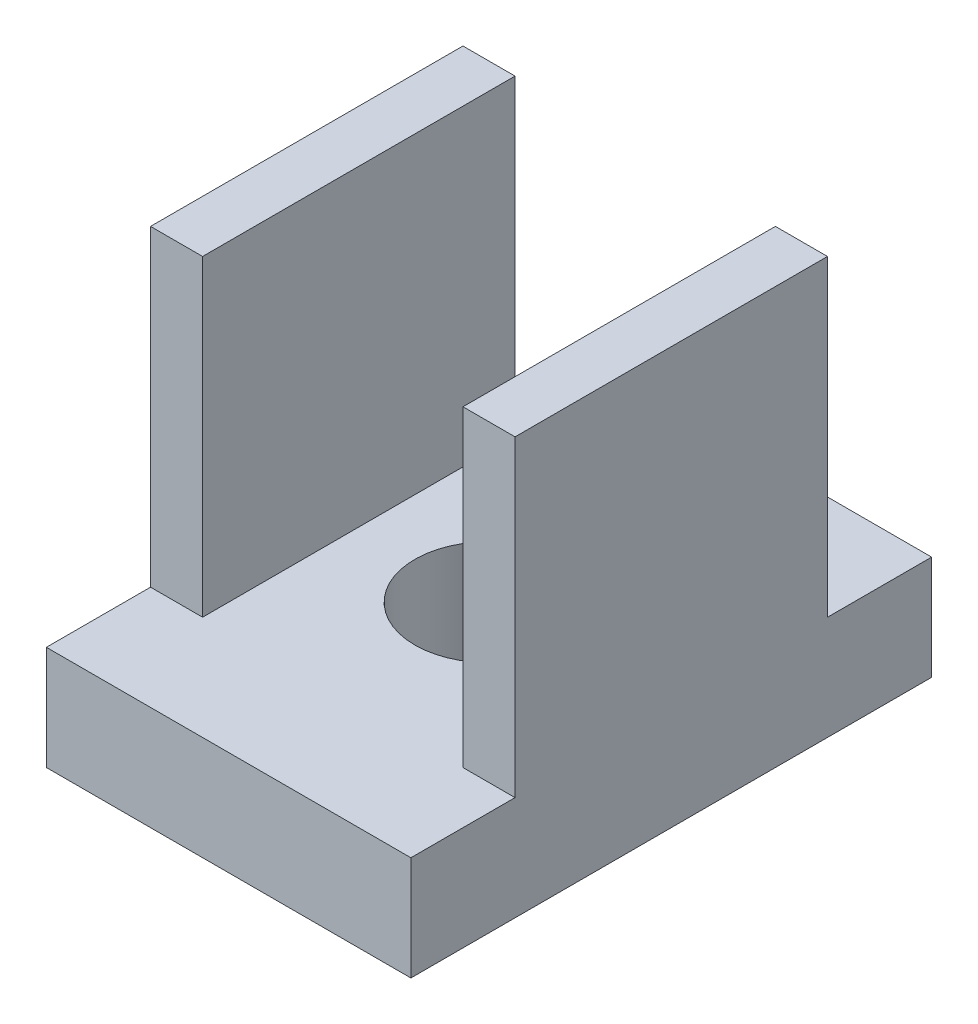
ISO-10303-21;
HEADER;
FILE_DESCRIPTION(('STEP AP214'),'2;1');
FILE_NAME('part.step','',(''),(''),'','','');
FILE_SCHEMA(('AUTOMOTIVE_DESIGN { 1 0 10303 214 1 1 1 1 }'));
ENDSEC;
DATA;
#1=APPLICATION_CONTEXT('core data for automotive mechanical design processes');
#2=APPLICATION_PROTOCOL_DEFINITION('international standard','automotive_design',2000,#1);
#3=PRODUCT_CONTEXT('',#1,'mechanical');
#4=PRODUCT('Part','Part','',(#3));
#5=PRODUCT_RELATED_PRODUCT_CATEGORY('part','',(#4));
#6=PRODUCT_DEFINITION_FORMATION('','',#4);
#7=PRODUCT_DEFINITION_CONTEXT('part definition',#1,'design');
#8=PRODUCT_DEFINITION('design','',#6,#7);
#9=PRODUCT_DEFINITION_SHAPE('','',#8);
#10=(LENGTH_UNIT() NAMED_UNIT(*) SI_UNIT(.MILLI.,.METRE.));
#11=(NAMED_UNIT(*) PLANE_ANGLE_UNIT() SI_UNIT($,.RADIAN.));
#12=(NAMED_UNIT(*) SI_UNIT($,.STERADIAN.) SOLID_ANGLE_UNIT());
#13=UNCERTAINTY_MEASURE_WITH_UNIT(LENGTH_MEASURE(1.E-05),#10,'distance_accuracy_value','');
#14=(GEOMETRIC_REPRESENTATION_CONTEXT(3) GLOBAL_UNCERTAINTY_ASSIGNED_CONTEXT((#13)) GLOBAL_UNIT_ASSIGNED_CONTEXT((#10,
#11,#12)) REPRESENTATION_CONTEXT('',''));
#15=CARTESIAN_POINT('',(0.,0.,0.));
#16=DIRECTION('',(0.,0.,1.));
#17=DIRECTION('',(1.,0.,0.));
#18=AXIS2_PLACEMENT_3D('',#15,#16,#17);
#19=CARTESIAN_POINT('',(0.,2.,0.));
#20=DIRECTION('',(0.,1.,0.));
#21=DIRECTION('',(0.,0.,1.));
#22=AXIS2_PLACEMENT_3D('',#19,#20,#21);
#23=PLANE('',#22);
#24=CARTESIAN_POINT('',(0.,2.,0.));
#25=DIRECTION('',(0.,1.,0.));
#26=DIRECTION('',(0.,0.,1.));
#27=AXIS2_PLACEMENT_3D('',#24,#25,#26);
#28=CIRCLE('',#27,1.425);
#29=CARTESIAN_POINT('',(0.,2.,1.425));
#30=VERTEX_POINT('',#29);
#31=EDGE_CURVE('E182',#30,#30,#28,.T.);
#32=ORIENTED_EDGE('',*,*,#31,.F.);
#33=EDGE_LOOP('',(#32));
#34=FACE_BOUND('',#33,.T.);
#35=DIRECTION('',(0.,0.,-1.));
#36=VECTOR('',#35,1.);
#37=CARTESIAN_POINT('',(-2.5,2.,3.));
#38=LINE('',#37,#36);
#39=CARTESIAN_POINT('',(-2.5,2.,3.));
#40=VERTEX_POINT('',#39);
#41=CARTESIAN_POINT('',(-2.5,2.,-3.));
#42=VERTEX_POINT('',#41);
#43=EDGE_CURVE('E52',#40,#42,#38,.T.);
#44=ORIENTED_EDGE('',*,*,#43,.F.);
#45=DIRECTION('',(1.,0.,0.));
#46=VECTOR('',#45,1.);
#47=CARTESIAN_POINT('',(-2.5,2.,3.));
#48=LINE('',#47,#46);
#49=CARTESIAN_POINT('',(-3.5,2.,3.));
#50=VERTEX_POINT('',#49);
#51=EDGE_CURVE('E146',#50,#40,#48,.T.);
#52=ORIENTED_EDGE('',*,*,#51,.F.);
#53=DIRECTION('',(0.,0.,1.));
#54=VECTOR('',#53,1.);
#55=CARTESIAN_POINT('',(-3.5,2.,-5.));
#56=LINE('',#55,#54);
#57=CARTESIAN_POINT('',(-3.5,2.,5.));
#58=VERTEX_POINT('',#57);
#59=EDGE_CURVE('E194',#50,#58,#56,.T.);
#60=ORIENTED_EDGE('',*,*,#59,.T.);
#61=DIRECTION('',(1.,0.,0.));
#62=VECTOR('',#61,1.);
#63=CARTESIAN_POINT('',(-3.5,2.,5.));
#64=LINE('',#63,#62);
#65=CARTESIAN_POINT('',(3.5,2.,5.));
#66=VERTEX_POINT('',#65);
#67=EDGE_CURVE('E197',#58,#66,#64,.T.);
#68=ORIENTED_EDGE('',*,*,#67,.T.);
#69=DIRECTION('',(0.,0.,-1.));
#70=VECTOR('',#69,1.);
#71=CARTESIAN_POINT('',(3.5,2.,-5.));
#72=LINE('',#71,#70);
#73=CARTESIAN_POINT('',(3.5,2.,3.));
#74=VERTEX_POINT('',#73);
#75=EDGE_CURVE('E189',#66,#74,#72,.T.);
#76=ORIENTED_EDGE('',*,*,#75,.T.);
#77=DIRECTION('',(1.,0.,0.));
#78=VECTOR('',#77,1.);
#79=CARTESIAN_POINT('',(2.5,2.,3.));
#80=LINE('',#79,#78);
#81=CARTESIAN_POINT('',(2.5,2.,3.));
#82=VERTEX_POINT('',#81);
#83=EDGE_CURVE('E150',#82,#74,#80,.T.);
#84=ORIENTED_EDGE('',*,*,#83,.F.);
#85=DIRECTION('',(0.,0.,1.));
#86=VECTOR('',#85,1.);
#87=CARTESIAN_POINT('',(2.5,2.,3.));
#88=LINE('',#87,#86);
#89=CARTESIAN_POINT('',(2.5,2.,-3.));
#90=VERTEX_POINT('',#89);
#91=EDGE_CURVE('E147',#90,#82,#88,.T.);
#92=ORIENTED_EDGE('',*,*,#91,.F.);
#93=DIRECTION('',(-1.,0.,0.));
#94=VECTOR('',#93,1.);
#95=CARTESIAN_POINT('',(2.5,2.,-3.));
#96=LINE('',#95,#94);
#97=CARTESIAN_POINT('',(3.5,2.,-3.));
#98=VERTEX_POINT('',#97);
#99=EDGE_CURVE('E160',#98,#90,#96,.T.);
#100=ORIENTED_EDGE('',*,*,#99,.F.);
#101=CARTESIAN_POINT('',(3.5,2.,-5.));
#102=VERTEX_POINT('',#101);
#103=EDGE_CURVE('E192',#98,#102,#72,.T.);
#104=ORIENTED_EDGE('',*,*,#103,.T.);
#105=DIRECTION('',(-1.,0.,0.));
#106=VECTOR('',#105,1.);
#107=CARTESIAN_POINT('',(-3.5,2.,-5.));
#108=LINE('',#107,#106);
#109=CARTESIAN_POINT('',(-3.5,2.,-5.));
#110=VERTEX_POINT('',#109);
#111=EDGE_CURVE('E191',#102,#110,#108,.T.);
#112=ORIENTED_EDGE('',*,*,#111,.T.);
#113=CARTESIAN_POINT('',(-3.5,2.,-3.));
#114=VERTEX_POINT('',#113);
#115=EDGE_CURVE('E195',#110,#114,#56,.T.);
#116=ORIENTED_EDGE('',*,*,#115,.T.);
#117=DIRECTION('',(-1.,0.,0.));
#118=VECTOR('',#117,1.);
#119=CARTESIAN_POINT('',(-2.5,2.,-3.));
#120=LINE('',#119,#118);
#121=EDGE_CURVE('E57',#42,#114,#120,.T.);
#122=ORIENTED_EDGE('',*,*,#121,.F.);
#123=EDGE_LOOP('',(#44,#52,#60,#68,#76,#84,#92,#100,#104,#112,#116,#122));
#124=FACE_BOUND('',#123,.T.);
#125=ADVANCED_FACE('F37',(#34,#124),#23,.T.);
#126=CARTESIAN_POINT('',(3.5,2.,-5.));
#127=DIRECTION('',(-1.,0.,0.));
#128=DIRECTION('',(0.,0.,1.));
#129=AXIS2_PLACEMENT_3D('',#126,#127,#128);
#130=PLANE('',#129);
#131=DIRECTION('',(0.,0.,-1.));
#132=VECTOR('',#131,1.);
#133=CARTESIAN_POINT('',(3.5,0.,-5.));
#134=LINE('',#133,#132);
#135=CARTESIAN_POINT('',(3.5,0.,5.));
#136=VERTEX_POINT('',#135);
#137=CARTESIAN_POINT('',(3.5,0.,-5.));
#138=VERTEX_POINT('',#137);
#139=EDGE_CURVE('E186',#136,#138,#134,.T.);
#140=ORIENTED_EDGE('',*,*,#139,.T.);
#141=DIRECTION('',(0.,-1.,0.));
#142=VECTOR('',#141,1.);
#143=CARTESIAN_POINT('',(3.5,2.,-5.));
#144=LINE('',#143,#142);
#145=EDGE_CURVE('E11',#102,#138,#144,.T.);
#146=ORIENTED_EDGE('',*,*,#145,.F.);
#147=ORIENTED_EDGE('',*,*,#103,.F.);
#148=DIRECTION('',(0.,-1.,0.));
#149=VECTOR('',#148,1.);
#150=CARTESIAN_POINT('',(3.5,8.,-3.));
#151=LINE('',#150,#149);
#152=CARTESIAN_POINT('',(3.5,8.,-3.));
#153=VERTEX_POINT('',#152);
#154=EDGE_CURVE('E173',#153,#98,#151,.T.);
#155=ORIENTED_EDGE('',*,*,#154,.F.);
#156=DIRECTION('',(0.,0.,-1.));
#157=VECTOR('',#156,1.);
#158=CARTESIAN_POINT('',(3.5,8.,3.));
#159=LINE('',#158,#157);
#160=CARTESIAN_POINT('',(3.5,8.,3.));
#161=VERTEX_POINT('',#160);
#162=EDGE_CURVE('E162',#161,#153,#159,.T.);
#163=ORIENTED_EDGE('',*,*,#162,.F.);
#164=DIRECTION('',(0.,-1.,0.));
#165=VECTOR('',#164,1.);
#166=CARTESIAN_POINT('',(3.5,8.,3.));
#167=LINE('',#166,#165);
#168=EDGE_CURVE('E176',#161,#74,#167,.T.);
#169=ORIENTED_EDGE('',*,*,#168,.T.);
#170=ORIENTED_EDGE('',*,*,#75,.F.);
#171=DIRECTION('',(0.,-1.,0.));
#172=VECTOR('',#171,1.);
#173=CARTESIAN_POINT('',(3.5,2.,5.));
#174=LINE('',#173,#172);
#175=EDGE_CURVE('E199',#66,#136,#174,.T.);
#176=ORIENTED_EDGE('',*,*,#175,.T.);
#177=EDGE_LOOP('',(#140,#146,#147,#155,#163,#169,#170,#176));
#178=FACE_BOUND('',#177,.T.);
#179=ADVANCED_FACE('F39',(#178),#130,.F.);
#180=CARTESIAN_POINT('',(-3.5,2.,-5.));
#181=DIRECTION('',(0.,0.,1.));
#182=DIRECTION('',(1.,0.,0.));
#183=AXIS2_PLACEMENT_3D('',#180,#181,#182);
#184=PLANE('',#183);
#185=DIRECTION('',(-1.,0.,0.));
#186=VECTOR('',#185,1.);
#187=CARTESIAN_POINT('',(-3.5,0.,-5.));
#188=LINE('',#187,#186);
#189=CARTESIAN_POINT('',(-3.5,0.,-5.));
#190=VERTEX_POINT('',#189);
#191=EDGE_CURVE('E202',#138,#190,#188,.T.);
#192=ORIENTED_EDGE('',*,*,#191,.T.);
#193=DIRECTION('',(0.,-1.,0.));
#194=VECTOR('',#193,1.);
#195=CARTESIAN_POINT('',(-3.5,2.,-5.));
#196=LINE('',#195,#194);
#197=EDGE_CURVE('E45',#110,#190,#196,.T.);
#198=ORIENTED_EDGE('',*,*,#197,.F.);
#199=ORIENTED_EDGE('',*,*,#111,.F.);
#200=ORIENTED_EDGE('',*,*,#145,.T.);
#201=EDGE_LOOP('',(#192,#198,#199,#200));
#202=FACE_BOUND('',#201,.T.);
#203=ADVANCED_FACE('F247',(#202),#184,.F.);
#204=CARTESIAN_POINT('',(-3.5,2.,-5.));
#205=DIRECTION('',(1.,0.,0.));
#206=DIRECTION('',(0.,0.,-1.));
#207=AXIS2_PLACEMENT_3D('',#204,#205,#206);
#208=PLANE('',#207);
#209=DIRECTION('',(0.,0.,1.));
#210=VECTOR('',#209,1.);
#211=CARTESIAN_POINT('',(-3.5,0.,-5.));
#212=LINE('',#211,#210);
#213=CARTESIAN_POINT('',(-3.5,0.,5.));
#214=VERTEX_POINT('',#213);
#215=EDGE_CURVE('E204',#190,#214,#212,.T.);
#216=ORIENTED_EDGE('',*,*,#215,.T.);
#217=DIRECTION('',(0.,-1.,0.));
#218=VECTOR('',#217,1.);
#219=CARTESIAN_POINT('',(-3.5,2.,5.));
#220=LINE('',#219,#218);
#221=EDGE_CURVE('E210',#58,#214,#220,.T.);
#222=ORIENTED_EDGE('',*,*,#221,.F.);
#223=ORIENTED_EDGE('',*,*,#59,.F.);
#224=DIRECTION('',(0.,-1.,0.));
#225=VECTOR('',#224,1.);
#226=CARTESIAN_POINT('',(-3.5,8.,3.));
#227=LINE('',#226,#225);
#228=CARTESIAN_POINT('',(-3.5,8.,3.));
#229=VERTEX_POINT('',#228);
#230=EDGE_CURVE('E383',#229,#50,#227,.T.);
#231=ORIENTED_EDGE('',*,*,#230,.F.);
#232=DIRECTION('',(0.,0.,1.));
#233=VECTOR('',#232,1.);
#234=CARTESIAN_POINT('',(-3.5,8.,3.));
#235=LINE('',#234,#233);
#236=CARTESIAN_POINT('',(-3.5,8.,-3.));
#237=VERTEX_POINT('',#236);
#238=EDGE_CURVE('E140',#237,#229,#235,.T.);
#239=ORIENTED_EDGE('',*,*,#238,.F.);
#240=DIRECTION('',(0.,-1.,0.));
#241=VECTOR('',#240,1.);
#242=CARTESIAN_POINT('',(-3.5,8.,-3.));
#243=LINE('',#242,#241);
#244=EDGE_CURVE('E152',#237,#114,#243,.T.);
#245=ORIENTED_EDGE('',*,*,#244,.T.);
#246=ORIENTED_EDGE('',*,*,#115,.F.);
#247=ORIENTED_EDGE('',*,*,#197,.T.);
#248=EDGE_LOOP('',(#216,#222,#223,#231,#239,#245,#246,#247));
#249=FACE_BOUND('',#248,.T.);
#250=ADVANCED_FACE('F217',(#249),#208,.F.);
#251=CARTESIAN_POINT('',(-3.5,2.,5.));
#252=DIRECTION('',(0.,0.,-1.));
#253=DIRECTION('',(-1.,0.,0.));
#254=AXIS2_PLACEMENT_3D('',#251,#252,#253);
#255=PLANE('',#254);
#256=DIRECTION('',(1.,0.,0.));
#257=VECTOR('',#256,1.);
#258=CARTESIAN_POINT('',(-3.5,0.,5.));
#259=LINE('',#258,#257);
#260=EDGE_CURVE('E206',#214,#136,#259,.T.);
#261=ORIENTED_EDGE('',*,*,#260,.T.);
#262=ORIENTED_EDGE('',*,*,#175,.F.);
#263=ORIENTED_EDGE('',*,*,#67,.F.);
#264=ORIENTED_EDGE('',*,*,#221,.T.);
#265=EDGE_LOOP('',(#261,#262,#263,#264));
#266=FACE_BOUND('',#265,.T.);
#267=ADVANCED_FACE('F228',(#266),#255,.F.);
#268=CARTESIAN_POINT('',(0.,0.,0.));
#269=DIRECTION('',(0.,1.,0.));
#270=DIRECTION('',(0.,0.,1.));
#271=AXIS2_PLACEMENT_3D('',#268,#269,#270);
#272=PLANE('',#271);
#273=CARTESIAN_POINT('',(0.,0.,0.));
#274=DIRECTION('',(0.,1.,0.));
#275=DIRECTION('',(0.,0.,1.));
#276=AXIS2_PLACEMENT_3D('',#273,#274,#275);
#277=CIRCLE('',#276,1.425);
#278=CARTESIAN_POINT('',(0.,0.,1.425));
#279=VERTEX_POINT('',#278);
#280=EDGE_CURVE('E183',#279,#279,#277,.T.);
#281=ORIENTED_EDGE('',*,*,#280,.T.);
#282=EDGE_LOOP('',(#281));
#283=FACE_BOUND('',#282,.T.);
#284=ORIENTED_EDGE('',*,*,#139,.F.);
#285=ORIENTED_EDGE('',*,*,#260,.F.);
#286=ORIENTED_EDGE('',*,*,#215,.F.);
#287=ORIENTED_EDGE('',*,*,#191,.F.);
#288=EDGE_LOOP('',(#284,#285,#286,#287));
#289=FACE_BOUND('',#288,.T.);
#290=ADVANCED_FACE('F225',(#283,#289),#272,.F.);
#291=CARTESIAN_POINT('',(0.,0.,0.));
#292=DIRECTION('',(0.,1.,0.));
#293=DIRECTION('',(0.,0.,1.));
#294=AXIS2_PLACEMENT_3D('',#291,#292,#293);
#295=CYLINDRICAL_SURFACE('',#294,1.425);
#296=ORIENTED_EDGE('',*,*,#280,.F.);
#297=EDGE_LOOP('',(#296));
#298=FACE_BOUND('',#297,.T.);
#299=ORIENTED_EDGE('',*,*,#31,.T.);
#300=EDGE_LOOP('',(#299));
#301=FACE_BOUND('',#300,.T.);
#302=ADVANCED_FACE('F262',(#298,#301),#295,.F.);
#303=CARTESIAN_POINT('',(2.5,8.,3.));
#304=DIRECTION('',(1.,0.,0.));
#305=DIRECTION('',(0.,0.,-1.));
#306=AXIS2_PLACEMENT_3D('',#303,#304,#305);
#307=PLANE('',#306);
#308=ORIENTED_EDGE('',*,*,#91,.T.);
#309=DIRECTION('',(0.,-1.,0.));
#310=VECTOR('',#309,1.);
#311=CARTESIAN_POINT('',(2.5,8.,3.));
#312=LINE('',#311,#310);
#313=CARTESIAN_POINT('',(2.5,8.,3.));
#314=VERTEX_POINT('',#313);
#315=EDGE_CURVE('E179',#314,#82,#312,.T.);
#316=ORIENTED_EDGE('',*,*,#315,.F.);
#317=DIRECTION('',(0.,0.,1.));
#318=VECTOR('',#317,1.);
#319=CARTESIAN_POINT('',(2.5,8.,3.));
#320=LINE('',#319,#318);
#321=CARTESIAN_POINT('',(2.5,8.,-3.));
#322=VERTEX_POINT('',#321);
#323=EDGE_CURVE('E156',#322,#314,#320,.T.);
#324=ORIENTED_EDGE('',*,*,#323,.F.);
#325=DIRECTION('',(0.,-1.,0.));
#326=VECTOR('',#325,1.);
#327=CARTESIAN_POINT('',(2.5,8.,-3.));
#328=LINE('',#327,#326);
#329=EDGE_CURVE('E165',#322,#90,#328,.T.);
#330=ORIENTED_EDGE('',*,*,#329,.T.);
#331=EDGE_LOOP('',(#308,#316,#324,#330));
#332=FACE_BOUND('',#331,.T.);
#333=ADVANCED_FACE('F240',(#332),#307,.F.);
#334=CARTESIAN_POINT('',(2.5,8.,3.));
#335=DIRECTION('',(0.,0.,-1.));
#336=DIRECTION('',(-1.,0.,0.));
#337=AXIS2_PLACEMENT_3D('',#334,#335,#336);
#338=PLANE('',#337);
#339=ORIENTED_EDGE('',*,*,#83,.T.);
#340=ORIENTED_EDGE('',*,*,#168,.F.);
#341=DIRECTION('',(1.,0.,0.));
#342=VECTOR('',#341,1.);
#343=CARTESIAN_POINT('',(2.5,8.,3.));
#344=LINE('',#343,#342);
#345=EDGE_CURVE('E159',#314,#161,#344,.T.);
#346=ORIENTED_EDGE('',*,*,#345,.F.);
#347=ORIENTED_EDGE('',*,*,#315,.T.);
#348=EDGE_LOOP('',(#339,#340,#346,#347));
#349=FACE_BOUND('',#348,.T.);
#350=ADVANCED_FACE('F236',(#349),#338,.F.);
#351=CARTESIAN_POINT('',(2.5,8.,-3.));
#352=DIRECTION('',(0.,0.,1.));
#353=DIRECTION('',(1.,0.,0.));
#354=AXIS2_PLACEMENT_3D('',#351,#352,#353);
#355=PLANE('',#354);
#356=ORIENTED_EDGE('',*,*,#99,.T.);
#357=ORIENTED_EDGE('',*,*,#329,.F.);
#358=DIRECTION('',(-1.,0.,0.));
#359=VECTOR('',#358,1.);
#360=CARTESIAN_POINT('',(2.5,8.,-3.));
#361=LINE('',#360,#359);
#362=EDGE_CURVE('E164',#153,#322,#361,.T.);
#363=ORIENTED_EDGE('',*,*,#362,.F.);
#364=ORIENTED_EDGE('',*,*,#154,.T.);
#365=EDGE_LOOP('',(#356,#357,#363,#364));
#366=FACE_BOUND('',#365,.T.);
#367=ADVANCED_FACE('F244',(#366),#355,.F.);
#368=CARTESIAN_POINT('',(0.,8.,0.));
#369=DIRECTION('',(0.,-1.,0.));
#370=DIRECTION('',(0.,0.,-1.));
#371=AXIS2_PLACEMENT_3D('',#368,#369,#370);
#372=PLANE('',#371);
#373=ORIENTED_EDGE('',*,*,#323,.T.);
#374=ORIENTED_EDGE('',*,*,#345,.T.);
#375=ORIENTED_EDGE('',*,*,#162,.T.);
#376=ORIENTED_EDGE('',*,*,#362,.T.);
#377=EDGE_LOOP('',(#373,#374,#375,#376));
#378=FACE_BOUND('',#377,.T.);
#379=ADVANCED_FACE('F299',(#378),#372,.F.);
#380=CARTESIAN_POINT('',(-2.5,8.,3.));
#381=DIRECTION('',(0.,0.,-1.));
#382=DIRECTION('',(-1.,0.,0.));
#383=AXIS2_PLACEMENT_3D('',#380,#381,#382);
#384=PLANE('',#383);
#385=ORIENTED_EDGE('',*,*,#51,.T.);
#386=DIRECTION('',(0.,-1.,0.));
#387=VECTOR('',#386,1.);
#388=CARTESIAN_POINT('',(-2.5,8.,3.));
#389=LINE('',#388,#387);
#390=CARTESIAN_POINT('',(-2.5,8.,3.));
#391=VERTEX_POINT('',#390);
#392=EDGE_CURVE('E128',#391,#40,#389,.T.);
#393=ORIENTED_EDGE('',*,*,#392,.F.);
#394=DIRECTION('',(1.,0.,0.));
#395=VECTOR('',#394,1.);
#396=CARTESIAN_POINT('',(-2.5,8.,3.));
#397=LINE('',#396,#395);
#398=EDGE_CURVE('E135',#229,#391,#397,.T.);
#399=ORIENTED_EDGE('',*,*,#398,.F.);
#400=ORIENTED_EDGE('',*,*,#230,.T.);
#401=EDGE_LOOP('',(#385,#393,#399,#400));
#402=FACE_BOUND('',#401,.T.);
#403=ADVANCED_FACE('F145',(#402),#384,.F.);
#404=CARTESIAN_POINT('',(-2.5,8.,3.));
#405=DIRECTION('',(-1.,0.,0.));
#406=DIRECTION('',(0.,0.,1.));
#407=AXIS2_PLACEMENT_3D('',#404,#405,#406);
#408=PLANE('',#407);
#409=ORIENTED_EDGE('',*,*,#43,.T.);
#410=DIRECTION('',(0.,-1.,0.));
#411=VECTOR('',#410,1.);
#412=CARTESIAN_POINT('',(-2.5,8.,-3.));
#413=LINE('',#412,#411);
#414=CARTESIAN_POINT('',(-2.5,8.,-3.));
#415=VERTEX_POINT('',#414);
#416=EDGE_CURVE('E131',#415,#42,#413,.T.);
#417=ORIENTED_EDGE('',*,*,#416,.F.);
#418=DIRECTION('',(0.,0.,-1.));
#419=VECTOR('',#418,1.);
#420=CARTESIAN_POINT('',(-2.5,8.,3.));
#421=LINE('',#420,#419);
#422=EDGE_CURVE('E124',#391,#415,#421,.T.);
#423=ORIENTED_EDGE('',*,*,#422,.F.);
#424=ORIENTED_EDGE('',*,*,#392,.T.);
#425=EDGE_LOOP('',(#409,#417,#423,#424));
#426=FACE_BOUND('',#425,.T.);
#427=ADVANCED_FACE('F126',(#426),#408,.F.);
#428=CARTESIAN_POINT('',(-2.5,8.,-3.));
#429=DIRECTION('',(0.,0.,1.));
#430=DIRECTION('',(1.,0.,0.));
#431=AXIS2_PLACEMENT_3D('',#428,#429,#430);
#432=PLANE('',#431);
#433=ORIENTED_EDGE('',*,*,#121,.T.);
#434=ORIENTED_EDGE('',*,*,#244,.F.);
#435=DIRECTION('',(-1.,0.,0.));
#436=VECTOR('',#435,1.);
#437=CARTESIAN_POINT('',(-2.5,8.,-3.));
#438=LINE('',#437,#436);
#439=EDGE_CURVE('E134',#415,#237,#438,.T.);
#440=ORIENTED_EDGE('',*,*,#439,.F.);
#441=ORIENTED_EDGE('',*,*,#416,.T.);
#442=EDGE_LOOP('',(#433,#434,#440,#441));
#443=FACE_BOUND('',#442,.T.);
#444=ADVANCED_FACE('F319',(#443),#432,.F.);
#445=CARTESIAN_POINT('',(0.,8.,0.));
#446=DIRECTION('',(0.,-1.,0.));
#447=DIRECTION('',(0.,0.,-1.));
#448=AXIS2_PLACEMENT_3D('',#445,#446,#447);
#449=PLANE('',#448);
#450=ORIENTED_EDGE('',*,*,#398,.T.);
#451=ORIENTED_EDGE('',*,*,#422,.T.);
#452=ORIENTED_EDGE('',*,*,#439,.T.);
#453=ORIENTED_EDGE('',*,*,#238,.T.);
#454=EDGE_LOOP('',(#450,#451,#452,#453));
#455=FACE_BOUND('',#454,.T.);
#456=ADVANCED_FACE('F138',(#455),#449,.F.);
#457=CLOSED_SHELL('',(#125,#179,#203,#250,#267,#290,#302,#333,#350,#367,#379,#403,#427,#444,#456));
#458=MANIFOLD_SOLID_BREP('B2',#457);
#459=ADVANCED_BREP_SHAPE_REPRESENTATION('',(#18,#458),#14);
#460=SHAPE_DEFINITION_REPRESENTATION(#9,#459);
ENDSEC;
END-ISO-10303-21;
